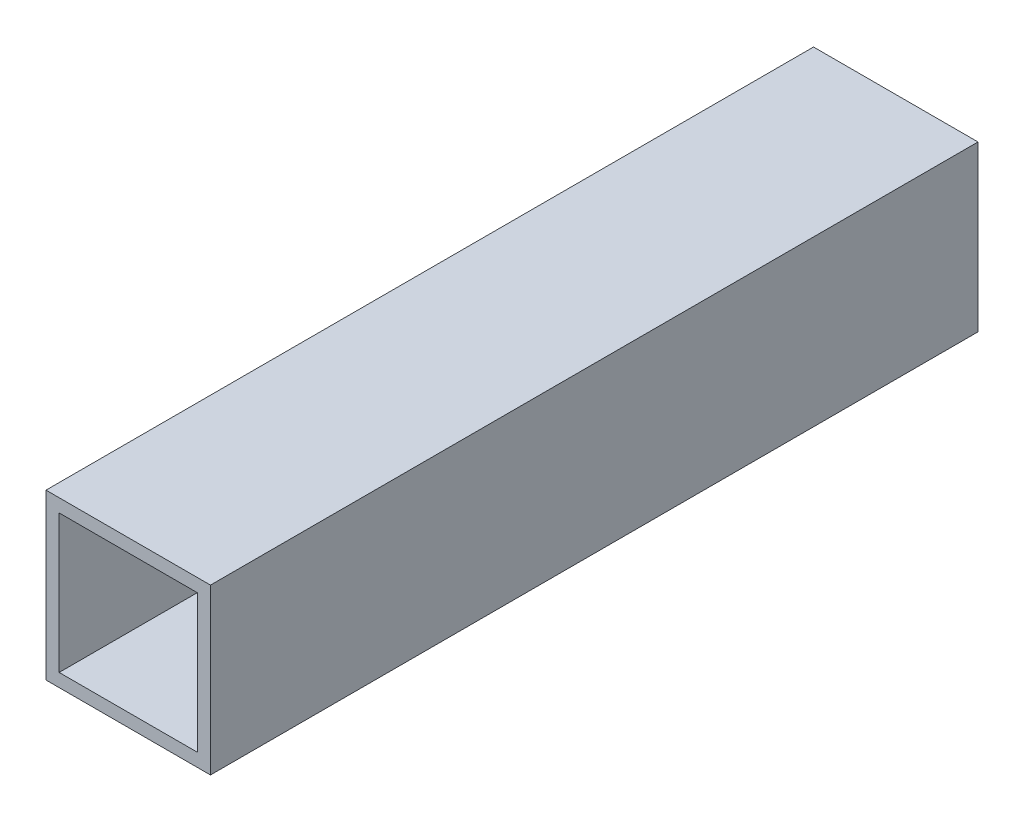
ISO-10303-21;
HEADER;
FILE_DESCRIPTION(('STEP AP214'),'2;1');
FILE_NAME('part.step','',(''),(''),'','','');
FILE_SCHEMA(('AUTOMOTIVE_DESIGN { 1 0 10303 214 1 1 1 1 }'));
ENDSEC;
DATA;
#1=APPLICATION_CONTEXT('core data for automotive mechanical design processes');
#2=APPLICATION_PROTOCOL_DEFINITION('international standard','automotive_design',2000,#1);
#3=PRODUCT_CONTEXT('',#1,'mechanical');
#4=PRODUCT('Part','Part','',(#3));
#5=PRODUCT_RELATED_PRODUCT_CATEGORY('part','',(#4));
#6=PRODUCT_DEFINITION_FORMATION('','',#4);
#7=PRODUCT_DEFINITION_CONTEXT('part definition',#1,'design');
#8=PRODUCT_DEFINITION('design','',#6,#7);
#9=PRODUCT_DEFINITION_SHAPE('','',#8);
#10=(LENGTH_UNIT() NAMED_UNIT(*) SI_UNIT(.MILLI.,.METRE.));
#11=(NAMED_UNIT(*) PLANE_ANGLE_UNIT() SI_UNIT($,.RADIAN.));
#12=(NAMED_UNIT(*) SI_UNIT($,.STERADIAN.) SOLID_ANGLE_UNIT());
#13=UNCERTAINTY_MEASURE_WITH_UNIT(LENGTH_MEASURE(1.E-05),#10,'distance_accuracy_value','');
#14=(GEOMETRIC_REPRESENTATION_CONTEXT(3) GLOBAL_UNCERTAINTY_ASSIGNED_CONTEXT((#13)) GLOBAL_UNIT_ASSIGNED_CONTEXT((#10,
#11,#12)) REPRESENTATION_CONTEXT('',''));
#15=CARTESIAN_POINT('',(0.,0.,0.));
#16=DIRECTION('',(0.,0.,1.));
#17=DIRECTION('',(1.,0.,0.));
#18=AXIS2_PLACEMENT_3D('',#15,#16,#17);
#19=CARTESIAN_POINT('',(0.,0.,70.));
#20=DIRECTION('',(0.,0.,-1.));
#21=DIRECTION('',(-1.,0.,0.));
#22=AXIS2_PLACEMENT_3D('',#19,#20,#21);
#23=PLANE('',#22);
#24=DIRECTION('',(0.,1.,0.));
#25=VECTOR('',#24,1.);
#26=CARTESIAN_POINT('',(7.5,-7.5,70.));
#27=LINE('',#26,#25);
#28=CARTESIAN_POINT('',(7.5,-7.5,70.));
#29=VERTEX_POINT('',#28);
#30=CARTESIAN_POINT('',(7.5,7.5,70.));
#31=VERTEX_POINT('',#30);
#32=EDGE_CURVE('E153',#29,#31,#27,.T.);
#33=ORIENTED_EDGE('',*,*,#32,.T.);
#34=DIRECTION('',(-1.,0.,0.));
#35=VECTOR('',#34,1.);
#36=CARTESIAN_POINT('',(-7.5,7.5,70.));
#37=LINE('',#36,#35);
#38=CARTESIAN_POINT('',(-7.5,7.5,70.));
#39=VERTEX_POINT('',#38);
#40=EDGE_CURVE('E157',#31,#39,#37,.T.);
#41=ORIENTED_EDGE('',*,*,#40,.T.);
#42=DIRECTION('',(0.,-1.,0.));
#43=VECTOR('',#42,1.);
#44=CARTESIAN_POINT('',(-7.5,-7.5,70.));
#45=LINE('',#44,#43);
#46=CARTESIAN_POINT('',(-7.5,-7.5,70.));
#47=VERTEX_POINT('',#46);
#48=EDGE_CURVE('E161',#39,#47,#45,.T.);
#49=ORIENTED_EDGE('',*,*,#48,.T.);
#50=DIRECTION('',(1.,0.,0.));
#51=VECTOR('',#50,1.);
#52=CARTESIAN_POINT('',(-7.5,-7.5,70.));
#53=LINE('',#52,#51);
#54=EDGE_CURVE('E164',#47,#29,#53,.T.);
#55=ORIENTED_EDGE('',*,*,#54,.T.);
#56=EDGE_LOOP('',(#33,#41,#49,#55));
#57=FACE_BOUND('',#56,.T.);
#58=DIRECTION('',(1.,0.,0.));
#59=VECTOR('',#58,1.);
#60=CARTESIAN_POINT('',(-6.3,-6.3,70.));
#61=LINE('',#60,#59);
#62=CARTESIAN_POINT('',(-6.3,-6.3,70.));
#63=VERTEX_POINT('',#62);
#64=CARTESIAN_POINT('',(6.3,-6.3,70.));
#65=VERTEX_POINT('',#64);
#66=EDGE_CURVE('E105',#63,#65,#61,.T.);
#67=ORIENTED_EDGE('',*,*,#66,.F.);
#68=DIRECTION('',(0.,-1.,0.));
#69=VECTOR('',#68,1.);
#70=CARTESIAN_POINT('',(-6.3,-6.3,70.));
#71=LINE('',#70,#69);
#72=CARTESIAN_POINT('',(-6.3,6.3,70.));
#73=VERTEX_POINT('',#72);
#74=EDGE_CURVE('E131',#73,#63,#71,.T.);
#75=ORIENTED_EDGE('',*,*,#74,.F.);
#76=DIRECTION('',(-1.,0.,0.));
#77=VECTOR('',#76,1.);
#78=CARTESIAN_POINT('',(-6.3,6.3,70.));
#79=LINE('',#78,#77);
#80=CARTESIAN_POINT('',(6.3,6.3,70.));
#81=VERTEX_POINT('',#80);
#82=EDGE_CURVE('E127',#81,#73,#79,.T.);
#83=ORIENTED_EDGE('',*,*,#82,.F.);
#84=DIRECTION('',(0.,1.,0.));
#85=VECTOR('',#84,1.);
#86=CARTESIAN_POINT('',(6.3,-6.3,70.));
#87=LINE('',#86,#85);
#88=EDGE_CURVE('E114',#65,#81,#87,.T.);
#89=ORIENTED_EDGE('',*,*,#88,.F.);
#90=EDGE_LOOP('',(#67,#75,#83,#89));
#91=FACE_BOUND('',#90,.T.);
#92=ADVANCED_FACE('F39',(#57,#91),#23,.F.);
#93=CARTESIAN_POINT('',(0.,0.,0.));
#94=DIRECTION('',(0.,0.,-1.));
#95=DIRECTION('',(-1.,0.,0.));
#96=AXIS2_PLACEMENT_3D('',#93,#94,#95);
#97=PLANE('',#96);
#98=DIRECTION('',(0.,1.,0.));
#99=VECTOR('',#98,1.);
#100=CARTESIAN_POINT('',(7.5,-7.5,0.));
#101=LINE('',#100,#99);
#102=CARTESIAN_POINT('',(7.5,-7.5,0.));
#103=VERTEX_POINT('',#102);
#104=CARTESIAN_POINT('',(7.5,7.5,0.));
#105=VERTEX_POINT('',#104);
#106=EDGE_CURVE('E123',#103,#105,#101,.T.);
#107=ORIENTED_EDGE('',*,*,#106,.F.);
#108=DIRECTION('',(1.,0.,0.));
#109=VECTOR('',#108,1.);
#110=CARTESIAN_POINT('',(-7.5,-7.5,0.));
#111=LINE('',#110,#109);
#112=CARTESIAN_POINT('',(-7.5,-7.5,0.));
#113=VERTEX_POINT('',#112);
#114=EDGE_CURVE('E158',#113,#103,#111,.T.);
#115=ORIENTED_EDGE('',*,*,#114,.F.);
#116=DIRECTION('',(0.,-1.,0.));
#117=VECTOR('',#116,1.);
#118=CARTESIAN_POINT('',(-7.5,-7.5,0.));
#119=LINE('',#118,#117);
#120=CARTESIAN_POINT('',(-7.5,7.5,0.));
#121=VERTEX_POINT('',#120);
#122=EDGE_CURVE('E174',#121,#113,#119,.T.);
#123=ORIENTED_EDGE('',*,*,#122,.F.);
#124=DIRECTION('',(-1.,0.,0.));
#125=VECTOR('',#124,1.);
#126=CARTESIAN_POINT('',(-7.5,7.5,0.));
#127=LINE('',#126,#125);
#128=EDGE_CURVE('E171',#105,#121,#127,.T.);
#129=ORIENTED_EDGE('',*,*,#128,.F.);
#130=EDGE_LOOP('',(#107,#115,#123,#129));
#131=FACE_BOUND('',#130,.T.);
#132=DIRECTION('',(0.,-1.,0.));
#133=VECTOR('',#132,1.);
#134=CARTESIAN_POINT('',(-6.3,-6.3,0.));
#135=LINE('',#134,#133);
#136=CARTESIAN_POINT('',(-6.3,6.3,0.));
#137=VERTEX_POINT('',#136);
#138=CARTESIAN_POINT('',(-6.3,-6.3,0.));
#139=VERTEX_POINT('',#138);
#140=EDGE_CURVE('E115',#137,#139,#135,.T.);
#141=ORIENTED_EDGE('',*,*,#140,.T.);
#142=DIRECTION('',(1.,0.,0.));
#143=VECTOR('',#142,1.);
#144=CARTESIAN_POINT('',(-6.3,-6.3,0.));
#145=LINE('',#144,#143);
#146=CARTESIAN_POINT('',(6.3,-6.3,0.));
#147=VERTEX_POINT('',#146);
#148=EDGE_CURVE('E63',#139,#147,#145,.T.);
#149=ORIENTED_EDGE('',*,*,#148,.T.);
#150=DIRECTION('',(0.,1.,0.));
#151=VECTOR('',#150,1.);
#152=CARTESIAN_POINT('',(6.3,-6.3,0.));
#153=LINE('',#152,#151);
#154=CARTESIAN_POINT('',(6.3,6.3,0.));
#155=VERTEX_POINT('',#154);
#156=EDGE_CURVE('E121',#147,#155,#153,.T.);
#157=ORIENTED_EDGE('',*,*,#156,.T.);
#158=DIRECTION('',(-1.,0.,0.));
#159=VECTOR('',#158,1.);
#160=CARTESIAN_POINT('',(-6.3,6.3,0.));
#161=LINE('',#160,#159);
#162=EDGE_CURVE('E140',#155,#137,#161,.T.);
#163=ORIENTED_EDGE('',*,*,#162,.T.);
#164=EDGE_LOOP('',(#141,#149,#157,#163));
#165=FACE_BOUND('',#164,.T.);
#166=ADVANCED_FACE('F197',(#131,#165),#97,.T.);
#167=CARTESIAN_POINT('',(7.5,-7.5,70.));
#168=DIRECTION('',(-1.,0.,0.));
#169=DIRECTION('',(0.,0.,1.));
#170=AXIS2_PLACEMENT_3D('',#167,#168,#169);
#171=PLANE('',#170);
#172=ORIENTED_EDGE('',*,*,#106,.T.);
#173=DIRECTION('',(0.,0.,-1.));
#174=VECTOR('',#173,1.);
#175=CARTESIAN_POINT('',(7.5,7.5,70.));
#176=LINE('',#175,#174);
#177=EDGE_CURVE('E11',#31,#105,#176,.T.);
#178=ORIENTED_EDGE('',*,*,#177,.F.);
#179=ORIENTED_EDGE('',*,*,#32,.F.);
#180=DIRECTION('',(0.,0.,-1.));
#181=VECTOR('',#180,1.);
#182=CARTESIAN_POINT('',(7.5,-7.5,70.));
#183=LINE('',#182,#181);
#184=EDGE_CURVE('E167',#29,#103,#183,.T.);
#185=ORIENTED_EDGE('',*,*,#184,.T.);
#186=EDGE_LOOP('',(#172,#178,#179,#185));
#187=FACE_BOUND('',#186,.T.);
#188=ADVANCED_FACE('F41',(#187),#171,.F.);
#189=CARTESIAN_POINT('',(-7.5,7.5,70.));
#190=DIRECTION('',(0.,-1.,0.));
#191=DIRECTION('',(0.,0.,-1.));
#192=AXIS2_PLACEMENT_3D('',#189,#190,#191);
#193=PLANE('',#192);
#194=ORIENTED_EDGE('',*,*,#128,.T.);
#195=DIRECTION('',(0.,0.,-1.));
#196=VECTOR('',#195,1.);
#197=CARTESIAN_POINT('',(-7.5,7.5,70.));
#198=LINE('',#197,#196);
#199=EDGE_CURVE('E48',#39,#121,#198,.T.);
#200=ORIENTED_EDGE('',*,*,#199,.F.);
#201=ORIENTED_EDGE('',*,*,#40,.F.);
#202=ORIENTED_EDGE('',*,*,#177,.T.);
#203=EDGE_LOOP('',(#194,#200,#201,#202));
#204=FACE_BOUND('',#203,.T.);
#205=ADVANCED_FACE('F207',(#204),#193,.F.);
#206=CARTESIAN_POINT('',(-7.5,-7.5,70.));
#207=DIRECTION('',(1.,0.,0.));
#208=DIRECTION('',(0.,0.,-1.));
#209=AXIS2_PLACEMENT_3D('',#206,#207,#208);
#210=PLANE('',#209);
#211=ORIENTED_EDGE('',*,*,#122,.T.);
#212=DIRECTION('',(0.,0.,-1.));
#213=VECTOR('',#212,1.);
#214=CARTESIAN_POINT('',(-7.5,-7.5,70.));
#215=LINE('',#214,#213);
#216=EDGE_CURVE('E182',#47,#113,#215,.T.);
#217=ORIENTED_EDGE('',*,*,#216,.F.);
#218=ORIENTED_EDGE('',*,*,#48,.F.);
#219=ORIENTED_EDGE('',*,*,#199,.T.);
#220=EDGE_LOOP('',(#211,#217,#218,#219));
#221=FACE_BOUND('',#220,.T.);
#222=ADVANCED_FACE('F191',(#221),#210,.F.);
#223=CARTESIAN_POINT('',(-7.5,-7.5,70.));
#224=DIRECTION('',(0.,1.,0.));
#225=DIRECTION('',(0.,0.,1.));
#226=AXIS2_PLACEMENT_3D('',#223,#224,#225);
#227=PLANE('',#226);
#228=ORIENTED_EDGE('',*,*,#114,.T.);
#229=ORIENTED_EDGE('',*,*,#184,.F.);
#230=ORIENTED_EDGE('',*,*,#54,.F.);
#231=ORIENTED_EDGE('',*,*,#216,.T.);
#232=EDGE_LOOP('',(#228,#229,#230,#231));
#233=FACE_BOUND('',#232,.T.);
#234=ADVANCED_FACE('F201',(#233),#227,.F.);
#235=CARTESIAN_POINT('',(-6.3,-6.3,70.));
#236=DIRECTION('',(0.,1.,0.));
#237=DIRECTION('',(0.,0.,1.));
#238=AXIS2_PLACEMENT_3D('',#235,#236,#237);
#239=PLANE('',#238);
#240=ORIENTED_EDGE('',*,*,#148,.F.);
#241=DIRECTION('',(0.,0.,-1.));
#242=VECTOR('',#241,1.);
#243=CARTESIAN_POINT('',(-6.3,-6.3,70.));
#244=LINE('',#243,#242);
#245=EDGE_CURVE('E109',#63,#139,#244,.T.);
#246=ORIENTED_EDGE('',*,*,#245,.F.);
#247=ORIENTED_EDGE('',*,*,#66,.T.);
#248=DIRECTION('',(0.,0.,-1.));
#249=VECTOR('',#248,1.);
#250=CARTESIAN_POINT('',(6.3,-6.3,70.));
#251=LINE('',#250,#249);
#252=EDGE_CURVE('E108',#65,#147,#251,.T.);
#253=ORIENTED_EDGE('',*,*,#252,.T.);
#254=EDGE_LOOP('',(#240,#246,#247,#253));
#255=FACE_BOUND('',#254,.T.);
#256=ADVANCED_FACE('F107',(#255),#239,.T.);
#257=CARTESIAN_POINT('',(6.3,-6.3,70.));
#258=DIRECTION('',(-1.,0.,0.));
#259=DIRECTION('',(0.,0.,1.));
#260=AXIS2_PLACEMENT_3D('',#257,#258,#259);
#261=PLANE('',#260);
#262=ORIENTED_EDGE('',*,*,#156,.F.);
#263=ORIENTED_EDGE('',*,*,#252,.F.);
#264=ORIENTED_EDGE('',*,*,#88,.T.);
#265=DIRECTION('',(0.,0.,-1.));
#266=VECTOR('',#265,1.);
#267=CARTESIAN_POINT('',(6.3,6.3,70.));
#268=LINE('',#267,#266);
#269=EDGE_CURVE('E124',#81,#155,#268,.T.);
#270=ORIENTED_EDGE('',*,*,#269,.T.);
#271=EDGE_LOOP('',(#262,#263,#264,#270));
#272=FACE_BOUND('',#271,.T.);
#273=ADVANCED_FACE('F118',(#272),#261,.T.);
#274=CARTESIAN_POINT('',(-6.3,6.3,70.));
#275=DIRECTION('',(0.,-1.,0.));
#276=DIRECTION('',(0.,0.,-1.));
#277=AXIS2_PLACEMENT_3D('',#274,#275,#276);
#278=PLANE('',#277);
#279=ORIENTED_EDGE('',*,*,#162,.F.);
#280=ORIENTED_EDGE('',*,*,#269,.F.);
#281=ORIENTED_EDGE('',*,*,#82,.T.);
#282=DIRECTION('',(0.,0.,-1.));
#283=VECTOR('',#282,1.);
#284=CARTESIAN_POINT('',(-6.3,6.3,70.));
#285=LINE('',#284,#283);
#286=EDGE_CURVE('E55',#73,#137,#285,.T.);
#287=ORIENTED_EDGE('',*,*,#286,.T.);
#288=EDGE_LOOP('',(#279,#280,#281,#287));
#289=FACE_BOUND('',#288,.T.);
#290=ADVANCED_FACE('F230',(#289),#278,.T.);
#291=CARTESIAN_POINT('',(-6.3,-6.3,70.));
#292=DIRECTION('',(1.,0.,0.));
#293=DIRECTION('',(0.,0.,-1.));
#294=AXIS2_PLACEMENT_3D('',#291,#292,#293);
#295=PLANE('',#294);
#296=ORIENTED_EDGE('',*,*,#140,.F.);
#297=ORIENTED_EDGE('',*,*,#286,.F.);
#298=ORIENTED_EDGE('',*,*,#74,.T.);
#299=ORIENTED_EDGE('',*,*,#245,.T.);
#300=EDGE_LOOP('',(#296,#297,#298,#299));
#301=FACE_BOUND('',#300,.T.);
#302=ADVANCED_FACE('F234',(#301),#295,.T.);
#303=CLOSED_SHELL('',(#92,#166,#188,#205,#222,#234,#256,#273,#290,#302));
#304=MANIFOLD_SOLID_BREP('B2',#303);
#305=ADVANCED_BREP_SHAPE_REPRESENTATION('',(#18,#304),#14);
#306=SHAPE_DEFINITION_REPRESENTATION(#9,#305);
ENDSEC;
END-ISO-10303-21;
